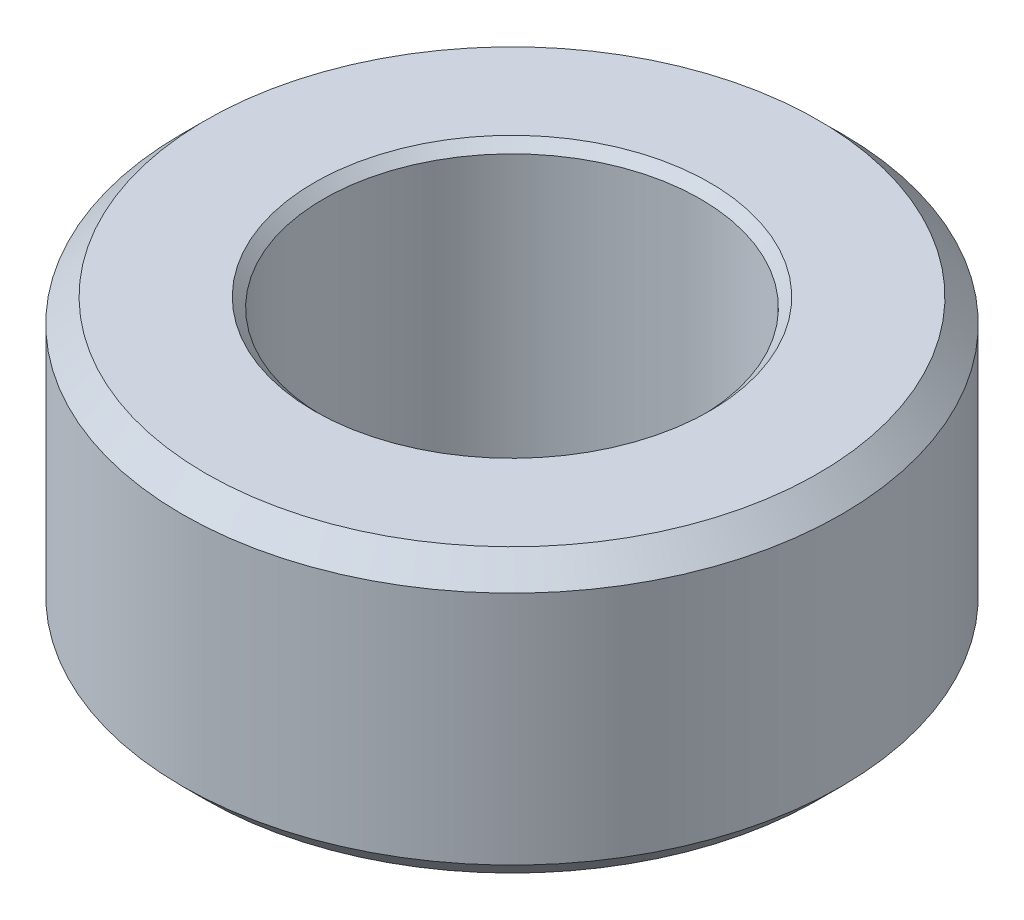
ISO-10303-21;
HEADER;
FILE_DESCRIPTION(('STEP AP214'),'2;1');
FILE_NAME('part.step','',(''),(''),'','','');
FILE_SCHEMA(('AUTOMOTIVE_DESIGN { 1 0 10303 214 1 1 1 1 }'));
ENDSEC;
DATA;
#1=APPLICATION_CONTEXT('core data for automotive mechanical design processes');
#2=APPLICATION_PROTOCOL_DEFINITION('international standard','automotive_design',2000,#1);
#3=PRODUCT_CONTEXT('',#1,'mechanical');
#4=PRODUCT('Part','Part','',(#3));
#5=PRODUCT_RELATED_PRODUCT_CATEGORY('part','',(#4));
#6=PRODUCT_DEFINITION_FORMATION('','',#4);
#7=PRODUCT_DEFINITION_CONTEXT('part definition',#1,'design');
#8=PRODUCT_DEFINITION('design','',#6,#7);
#9=PRODUCT_DEFINITION_SHAPE('','',#8);
#10=(LENGTH_UNIT() NAMED_UNIT(*) SI_UNIT(.MILLI.,.METRE.));
#11=(NAMED_UNIT(*) PLANE_ANGLE_UNIT() SI_UNIT($,.RADIAN.));
#12=(NAMED_UNIT(*) SI_UNIT($,.STERADIAN.) SOLID_ANGLE_UNIT());
#13=UNCERTAINTY_MEASURE_WITH_UNIT(LENGTH_MEASURE(1.E-05),#10,'distance_accuracy_value','');
#14=(GEOMETRIC_REPRESENTATION_CONTEXT(3) GLOBAL_UNCERTAINTY_ASSIGNED_CONTEXT((#13)) GLOBAL_UNIT_ASSIGNED_CONTEXT((#10,
#11,#12)) REPRESENTATION_CONTEXT('',''));
#15=CARTESIAN_POINT('',(0.,0.,0.));
#16=DIRECTION('',(0.,0.,1.));
#17=DIRECTION('',(1.,0.,0.));
#18=AXIS2_PLACEMENT_3D('',#15,#16,#17);
#19=CARTESIAN_POINT('',(0.,6.,0.));
#20=DIRECTION('',(0.,1.,0.));
#21=DIRECTION('',(0.,0.,1.));
#22=AXIS2_PLACEMENT_3D('',#19,#20,#21);
#23=PLANE('',#22);
#24=CARTESIAN_POINT('',(0.,6.,0.));
#25=DIRECTION('',(0.,1.,0.));
#26=DIRECTION('',(0.,0.,1.));
#27=AXIS2_PLACEMENT_3D('',#24,#25,#26);
#28=CIRCLE('',#27,4.2);
#29=CARTESIAN_POINT('',(0.,6.,4.2));
#30=VERTEX_POINT('',#29);
#31=EDGE_CURVE('E10',#30,#30,#28,.F.);
#32=ORIENTED_EDGE('',*,*,#31,.T.);
#33=EDGE_LOOP('',(#32));
#34=FACE_BOUND('',#33,.T.);
#35=CARTESIAN_POINT('',(0.,6.,0.));
#36=DIRECTION('',(0.,1.,0.));
#37=DIRECTION('',(0.,0.,1.));
#38=AXIS2_PLACEMENT_3D('',#35,#36,#37);
#39=CIRCLE('',#38,6.5);
#40=CARTESIAN_POINT('',(0.,6.,6.5));
#41=VERTEX_POINT('',#40);
#42=EDGE_CURVE('E64',#41,#41,#39,.T.);
#43=ORIENTED_EDGE('',*,*,#42,.T.);
#44=EDGE_LOOP('',(#43));
#45=FACE_BOUND('',#44,.T.);
#46=ADVANCED_FACE('F39',(#34,#45),#23,.T.);
#47=CARTESIAN_POINT('',(0.,0.,0.));
#48=DIRECTION('',(0.,1.,0.));
#49=DIRECTION('',(0.,0.,1.));
#50=AXIS2_PLACEMENT_3D('',#47,#48,#49);
#51=PLANE('',#50);
#52=CARTESIAN_POINT('',(0.,0.,0.));
#53=DIRECTION('',(0.,1.,0.));
#54=DIRECTION('',(0.,0.,1.));
#55=AXIS2_PLACEMENT_3D('',#52,#53,#54);
#56=CIRCLE('',#55,4.2);
#57=CARTESIAN_POINT('',(0.,0.,4.2));
#58=VERTEX_POINT('',#57);
#59=EDGE_CURVE('E58',#58,#58,#56,.T.);
#60=ORIENTED_EDGE('',*,*,#59,.T.);
#61=EDGE_LOOP('',(#60));
#62=FACE_BOUND('',#61,.T.);
#63=CARTESIAN_POINT('',(0.,0.,0.));
#64=DIRECTION('',(0.,1.,0.));
#65=DIRECTION('',(0.,0.,1.));
#66=AXIS2_PLACEMENT_3D('',#63,#64,#65);
#67=CIRCLE('',#66,6.5);
#68=CARTESIAN_POINT('',(0.,0.,6.5));
#69=VERTEX_POINT('',#68);
#70=EDGE_CURVE('E68',#69,#69,#67,.F.);
#71=ORIENTED_EDGE('',*,*,#70,.T.);
#72=EDGE_LOOP('',(#71));
#73=FACE_BOUND('',#72,.T.);
#74=ADVANCED_FACE('F92',(#62,#73),#51,.F.);
#75=CARTESIAN_POINT('',(0.,6.,0.));
#76=DIRECTION('',(0.,-1.,0.));
#77=DIRECTION('',(0.,0.,-1.));
#78=AXIS2_PLACEMENT_3D('',#75,#76,#77);
#79=CYLINDRICAL_SURFACE('',#78,7.);
#80=CARTESIAN_POINT('',(0.,0.5,0.));
#81=DIRECTION('',(0.,1.,0.));
#82=DIRECTION('',(0.,0.,1.));
#83=AXIS2_PLACEMENT_3D('',#80,#81,#82);
#84=CIRCLE('',#83,7.);
#85=CARTESIAN_POINT('',(0.,0.5,7.));
#86=VERTEX_POINT('',#85);
#87=EDGE_CURVE('E72',#86,#86,#84,.T.);
#88=ORIENTED_EDGE('',*,*,#87,.T.);
#89=EDGE_LOOP('',(#88));
#90=FACE_BOUND('',#89,.T.);
#91=CARTESIAN_POINT('',(0.,5.5,0.));
#92=DIRECTION('',(0.,1.,0.));
#93=DIRECTION('',(0.,0.,1.));
#94=AXIS2_PLACEMENT_3D('',#91,#92,#93);
#95=CIRCLE('',#94,7.);
#96=CARTESIAN_POINT('',(0.,5.5,7.));
#97=VERTEX_POINT('',#96);
#98=EDGE_CURVE('E76',#97,#97,#95,.F.);
#99=ORIENTED_EDGE('',*,*,#98,.T.);
#100=EDGE_LOOP('',(#99));
#101=FACE_BOUND('',#100,.T.);
#102=ADVANCED_FACE('F81',(#90,#101),#79,.T.);
#103=CARTESIAN_POINT('',(0.,6.,0.));
#104=DIRECTION('',(0.,-1.,0.));
#105=DIRECTION('',(0.,0.,-1.));
#106=AXIS2_PLACEMENT_3D('',#103,#104,#105);
#107=CYLINDRICAL_SURFACE('',#106,4.);
#108=CARTESIAN_POINT('',(0.,0.200000000000002,0.));
#109=DIRECTION('',(0.,1.,0.));
#110=DIRECTION('',(0.,0.,1.));
#111=AXIS2_PLACEMENT_3D('',#108,#109,#110);
#112=CIRCLE('',#111,4.);
#113=CARTESIAN_POINT('',(0.,0.200000000000002,4.));
#114=VERTEX_POINT('',#113);
#115=EDGE_CURVE('E48',#114,#114,#112,.F.);
#116=ORIENTED_EDGE('',*,*,#115,.T.);
#117=EDGE_LOOP('',(#116));
#118=FACE_BOUND('',#117,.T.);
#119=CARTESIAN_POINT('',(0.,5.8,0.));
#120=DIRECTION('',(0.,1.,0.));
#121=DIRECTION('',(0.,0.,1.));
#122=AXIS2_PLACEMENT_3D('',#119,#120,#121);
#123=CIRCLE('',#122,4.);
#124=CARTESIAN_POINT('',(0.,5.8,4.));
#125=VERTEX_POINT('',#124);
#126=EDGE_CURVE('E53',#125,#125,#123,.T.);
#127=ORIENTED_EDGE('',*,*,#126,.T.);
#128=EDGE_LOOP('',(#127));
#129=FACE_BOUND('',#128,.T.);
#130=ADVANCED_FACE('F100',(#118,#129),#107,.F.);
#131=CARTESIAN_POINT('',(0.,0.5,0.));
#132=DIRECTION('',(0.,1.,0.));
#133=DIRECTION('',(0.,0.,1.));
#134=AXIS2_PLACEMENT_3D('',#131,#132,#133);
#135=CONICAL_SURFACE('',#134,7.,0.78539816339745);
#136=ORIENTED_EDGE('',*,*,#70,.F.);
#137=EDGE_LOOP('',(#136));
#138=FACE_BOUND('',#137,.T.);
#139=ORIENTED_EDGE('',*,*,#87,.F.);
#140=EDGE_LOOP('',(#139));
#141=FACE_BOUND('',#140,.T.);
#142=ADVANCED_FACE('F87',(#138,#141),#135,.T.);
#143=CARTESIAN_POINT('',(0.,6.,0.));
#144=DIRECTION('',(0.,-1.,0.));
#145=DIRECTION('',(0.,0.,-1.));
#146=AXIS2_PLACEMENT_3D('',#143,#144,#145);
#147=CONICAL_SURFACE('',#146,6.5,0.785398163397447);
#148=ORIENTED_EDGE('',*,*,#98,.F.);
#149=EDGE_LOOP('',(#148));
#150=FACE_BOUND('',#149,.T.);
#151=ORIENTED_EDGE('',*,*,#42,.F.);
#152=EDGE_LOOP('',(#151));
#153=FACE_BOUND('',#152,.T.);
#154=ADVANCED_FACE('F83',(#150,#153),#147,.T.);
#155=CARTESIAN_POINT('',(0.,0.,0.));
#156=DIRECTION('',(0.,-1.,0.));
#157=DIRECTION('',(0.,0.,-1.));
#158=AXIS2_PLACEMENT_3D('',#155,#156,#157);
#159=CONICAL_SURFACE('',#158,4.2,0.785398163397448);
#160=ORIENTED_EDGE('',*,*,#115,.F.);
#161=EDGE_LOOP('',(#160));
#162=FACE_BOUND('',#161,.T.);
#163=ORIENTED_EDGE('',*,*,#59,.F.);
#164=EDGE_LOOP('',(#163));
#165=FACE_BOUND('',#164,.T.);
#166=ADVANCED_FACE('F86',(#162,#165),#159,.F.);
#167=CARTESIAN_POINT('',(0.,5.8,0.));
#168=DIRECTION('',(0.,1.,0.));
#169=DIRECTION('',(0.,0.,1.));
#170=AXIS2_PLACEMENT_3D('',#167,#168,#169);
#171=CONICAL_SURFACE('',#170,4.,0.78539816339745);
#172=ORIENTED_EDGE('',*,*,#31,.F.);
#173=EDGE_LOOP('',(#172));
#174=FACE_BOUND('',#173,.T.);
#175=ORIENTED_EDGE('',*,*,#126,.F.);
#176=EDGE_LOOP('',(#175));
#177=FACE_BOUND('',#176,.T.);
#178=ADVANCED_FACE('F42',(#174,#177),#171,.F.);
#179=CLOSED_SHELL('',(#46,#74,#102,#130,#142,#154,#166,#178));
#180=MANIFOLD_SOLID_BREP('B2',#179);
#181=ADVANCED_BREP_SHAPE_REPRESENTATION('',(#18,#180),#14);
#182=SHAPE_DEFINITION_REPRESENTATION(#9,#181);
ENDSEC;
END-ISO-10303-21;
